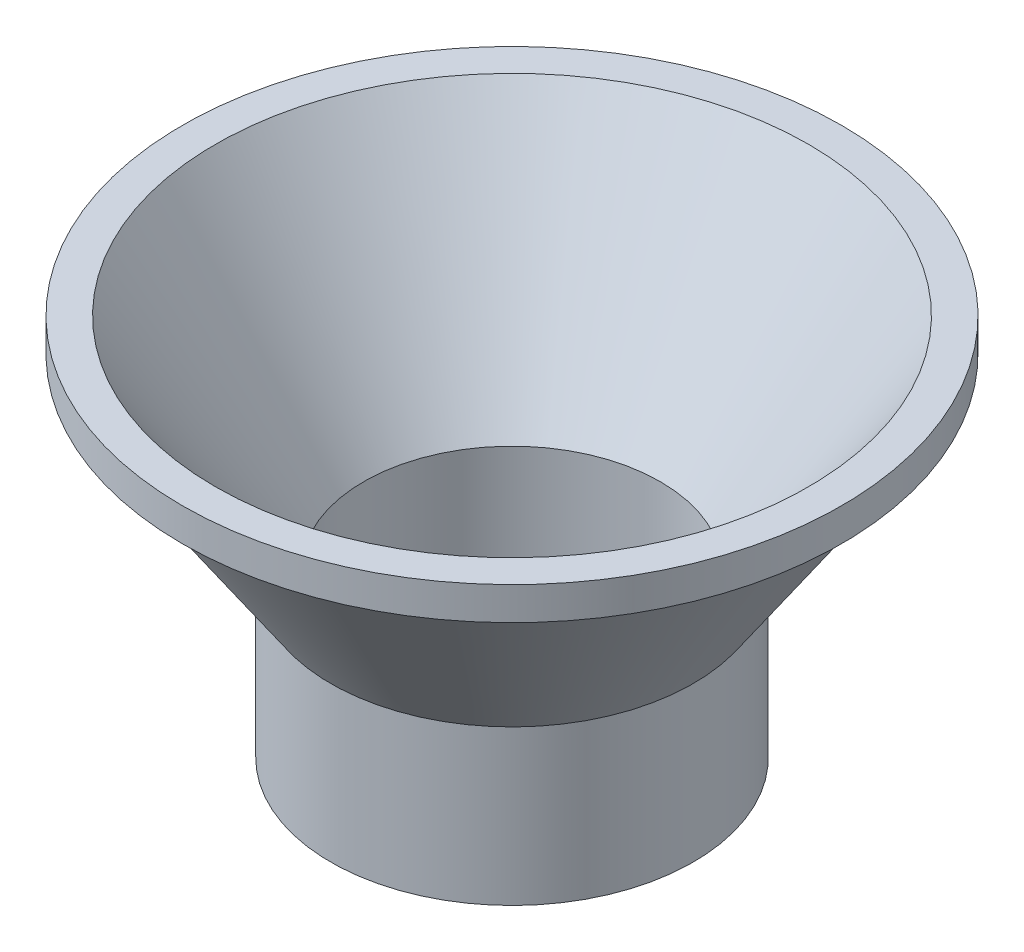
ISO-10303-21;
HEADER;
FILE_DESCRIPTION(('STEP AP214'),'2;1');
FILE_NAME('part.step','',(''),(''),'','','');
FILE_SCHEMA(('AUTOMOTIVE_DESIGN { 1 0 10303 214 1 1 1 1 }'));
ENDSEC;
DATA;
#1=APPLICATION_CONTEXT('core data for automotive mechanical design processes');
#2=APPLICATION_PROTOCOL_DEFINITION('international standard','automotive_design',2000,#1);
#3=PRODUCT_CONTEXT('',#1,'mechanical');
#4=PRODUCT('Part','Part','',(#3));
#5=PRODUCT_RELATED_PRODUCT_CATEGORY('part','',(#4));
#6=PRODUCT_DEFINITION_FORMATION('','',#4);
#7=PRODUCT_DEFINITION_CONTEXT('part definition',#1,'design');
#8=PRODUCT_DEFINITION('design','',#6,#7);
#9=PRODUCT_DEFINITION_SHAPE('','',#8);
#10=(LENGTH_UNIT() NAMED_UNIT(*) SI_UNIT(.MILLI.,.METRE.));
#11=(NAMED_UNIT(*) PLANE_ANGLE_UNIT() SI_UNIT($,.RADIAN.));
#12=(NAMED_UNIT(*) SI_UNIT($,.STERADIAN.) SOLID_ANGLE_UNIT());
#13=UNCERTAINTY_MEASURE_WITH_UNIT(LENGTH_MEASURE(1.E-05),#10,'distance_accuracy_value','');
#14=(GEOMETRIC_REPRESENTATION_CONTEXT(3) GLOBAL_UNCERTAINTY_ASSIGNED_CONTEXT((#13)) GLOBAL_UNIT_ASSIGNED_CONTEXT((#10,
#11,#12)) REPRESENTATION_CONTEXT('',''));
#15=CARTESIAN_POINT('',(0.,0.,0.));
#16=DIRECTION('',(0.,0.,1.));
#17=DIRECTION('',(1.,0.,0.));
#18=AXIS2_PLACEMENT_3D('',#15,#16,#17);
#19=CARTESIAN_POINT('',(-18.,13.2287565553229,0.));
#20=DIRECTION('',(0.,-1.,0.));
#21=DIRECTION('',(0.,0.,-1.));
#22=AXIS2_PLACEMENT_3D('',#19,#20,#21);
#23=PLANE('',#22);
#24=CARTESIAN_POINT('',(0.,13.2287565553229,0.));
#25=DIRECTION('',(0.,-1.,0.));
#26=DIRECTION('',(0.,0.,-1.));
#27=AXIS2_PLACEMENT_3D('',#24,#25,#26);
#28=CIRCLE('',#27,20.);
#29=CARTESIAN_POINT('',(0.,13.2287565553229,-20.));
#30=VERTEX_POINT('',#29);
#31=EDGE_CURVE('E63',#30,#30,#28,.T.);
#32=ORIENTED_EDGE('',*,*,#31,.F.);
#33=EDGE_LOOP('',(#32));
#34=FACE_BOUND('',#33,.T.);
#35=CARTESIAN_POINT('',(0.,13.228756555323,0.));
#36=DIRECTION('',(0.,-1.,0.));
#37=DIRECTION('',(0.,0.,-1.));
#38=AXIS2_PLACEMENT_3D('',#35,#36,#37);
#39=CIRCLE('',#38,18.);
#40=CARTESIAN_POINT('',(0.,13.228756555323,-18.));
#41=VERTEX_POINT('',#40);
#42=EDGE_CURVE('E10',#41,#41,#39,.T.);
#43=ORIENTED_EDGE('',*,*,#42,.T.);
#44=EDGE_LOOP('',(#43));
#45=FACE_BOUND('',#44,.T.);
#46=ADVANCED_FACE('F35',(#34,#45),#23,.F.);
#47=CARTESIAN_POINT('',(0.,0.,0.));
#48=DIRECTION('',(0.,1.,0.));
#49=DIRECTION('',(0.,0.,1.));
#50=AXIS2_PLACEMENT_3D('',#47,#48,#49);
#51=CONICAL_SURFACE('',#50,9.,0.59740641664535);
#52=ORIENTED_EDGE('',*,*,#42,.F.);
#53=EDGE_LOOP('',(#52));
#54=FACE_BOUND('',#53,.T.);
#55=CARTESIAN_POINT('',(0.,0.,0.));
#56=DIRECTION('',(0.,-1.,0.));
#57=DIRECTION('',(0.,0.,-1.));
#58=AXIS2_PLACEMENT_3D('',#55,#56,#57);
#59=CIRCLE('',#58,9.);
#60=CARTESIAN_POINT('',(0.,0.,-9.));
#61=VERTEX_POINT('',#60);
#62=EDGE_CURVE('E41',#61,#61,#59,.T.);
#63=ORIENTED_EDGE('',*,*,#62,.T.);
#64=EDGE_LOOP('',(#63));
#65=FACE_BOUND('',#64,.T.);
#66=ADVANCED_FACE('F71',(#54,#65),#51,.F.);
#67=CARTESIAN_POINT('',(0.,0.,0.));
#68=DIRECTION('',(0.,-1.,0.));
#69=DIRECTION('',(0.,0.,-1.));
#70=AXIS2_PLACEMENT_3D('',#67,#68,#69);
#71=CYLINDRICAL_SURFACE('',#70,9.);
#72=ORIENTED_EDGE('',*,*,#62,.F.);
#73=EDGE_LOOP('',(#72));
#74=FACE_BOUND('',#73,.T.);
#75=CARTESIAN_POINT('',(0.,-10.,0.));
#76=DIRECTION('',(0.,-1.,0.));
#77=DIRECTION('',(0.,0.,-1.));
#78=AXIS2_PLACEMENT_3D('',#75,#76,#77);
#79=CIRCLE('',#78,9.);
#80=CARTESIAN_POINT('',(0.,-10.,-9.));
#81=VERTEX_POINT('',#80);
#82=EDGE_CURVE('E45',#81,#81,#79,.T.);
#83=ORIENTED_EDGE('',*,*,#82,.T.);
#84=EDGE_LOOP('',(#83));
#85=FACE_BOUND('',#84,.T.);
#86=ADVANCED_FACE('F75',(#74,#85),#71,.F.);
#87=CARTESIAN_POINT('',(-9.,-10.,0.));
#88=DIRECTION('',(0.,-1.,0.));
#89=DIRECTION('',(0.,0.,-1.));
#90=AXIS2_PLACEMENT_3D('',#87,#88,#89);
#91=PLANE('',#90);
#92=CARTESIAN_POINT('',(0.,-10.,0.));
#93=DIRECTION('',(0.,-1.,0.));
#94=DIRECTION('',(0.,0.,-1.));
#95=AXIS2_PLACEMENT_3D('',#92,#93,#94);
#96=CIRCLE('',#95,11.);
#97=CARTESIAN_POINT('',(0.,-10.,-11.));
#98=VERTEX_POINT('',#97);
#99=EDGE_CURVE('E49',#98,#98,#96,.T.);
#100=ORIENTED_EDGE('',*,*,#99,.T.);
#101=EDGE_LOOP('',(#100));
#102=FACE_BOUND('',#101,.T.);
#103=ORIENTED_EDGE('',*,*,#82,.F.);
#104=EDGE_LOOP('',(#103));
#105=FACE_BOUND('',#104,.T.);
#106=ADVANCED_FACE('F80',(#102,#105),#91,.T.);
#107=CARTESIAN_POINT('',(0.,0.,0.));
#108=DIRECTION('',(0.,-1.,0.));
#109=DIRECTION('',(0.,0.,-1.));
#110=AXIS2_PLACEMENT_3D('',#107,#108,#109);
#111=CYLINDRICAL_SURFACE('',#110,11.);
#112=CARTESIAN_POINT('',(0.,-0.615831876594899,0.));
#113=DIRECTION('',(0.,-1.,0.));
#114=DIRECTION('',(0.,0.,-1.));
#115=AXIS2_PLACEMENT_3D('',#112,#113,#114);
#116=CIRCLE('',#115,11.);
#117=CARTESIAN_POINT('',(0.,-0.615831876594899,-11.));
#118=VERTEX_POINT('',#117);
#119=EDGE_CURVE('E54',#118,#118,#116,.T.);
#120=ORIENTED_EDGE('',*,*,#119,.T.);
#121=EDGE_LOOP('',(#120));
#122=FACE_BOUND('',#121,.T.);
#123=ORIENTED_EDGE('',*,*,#99,.F.);
#124=EDGE_LOOP('',(#123));
#125=FACE_BOUND('',#124,.T.);
#126=ADVANCED_FACE('F86',(#122,#125),#111,.T.);
#127=CARTESIAN_POINT('',(0.,-0.615831876594899,0.));
#128=DIRECTION('',(0.,1.,0.));
#129=DIRECTION('',(0.,0.,1.));
#130=AXIS2_PLACEMENT_3D('',#127,#128,#129);
#131=CONICAL_SURFACE('',#130,11.,0.59740641664535);
#132=CARTESIAN_POINT('',(0.,11.2287565553229,0.));
#133=DIRECTION('',(0.,-1.,0.));
#134=DIRECTION('',(0.,0.,-1.));
#135=AXIS2_PLACEMENT_3D('',#132,#133,#134);
#136=CIRCLE('',#135,19.0583005244258);
#137=CARTESIAN_POINT('',(0.,11.2287565553229,-19.0583005244258));
#138=VERTEX_POINT('',#137);
#139=EDGE_CURVE('E57',#138,#138,#136,.T.);
#140=ORIENTED_EDGE('',*,*,#139,.T.);
#141=EDGE_LOOP('',(#140));
#142=FACE_BOUND('',#141,.T.);
#143=ORIENTED_EDGE('',*,*,#119,.F.);
#144=EDGE_LOOP('',(#143));
#145=FACE_BOUND('',#144,.T.);
#146=ADVANCED_FACE('F90',(#142,#145),#131,.T.);
#147=CARTESIAN_POINT('',(-18.,11.2287565553229,0.));
#148=DIRECTION('',(0.,-1.,0.));
#149=DIRECTION('',(0.,0.,-1.));
#150=AXIS2_PLACEMENT_3D('',#147,#148,#149);
#151=PLANE('',#150);
#152=CARTESIAN_POINT('',(0.,11.2287565553229,0.));
#153=DIRECTION('',(0.,-1.,0.));
#154=DIRECTION('',(0.,0.,-1.));
#155=AXIS2_PLACEMENT_3D('',#152,#153,#154);
#156=CIRCLE('',#155,20.);
#157=CARTESIAN_POINT('',(0.,11.2287565553229,-20.));
#158=VERTEX_POINT('',#157);
#159=EDGE_CURVE('E60',#158,#158,#156,.T.);
#160=ORIENTED_EDGE('',*,*,#159,.T.);
#161=EDGE_LOOP('',(#160));
#162=FACE_BOUND('',#161,.T.);
#163=ORIENTED_EDGE('',*,*,#139,.F.);
#164=EDGE_LOOP('',(#163));
#165=FACE_BOUND('',#164,.T.);
#166=ADVANCED_FACE('F94',(#162,#165),#151,.T.);
#167=CARTESIAN_POINT('',(0.,0.,0.));
#168=DIRECTION('',(0.,-1.,0.));
#169=DIRECTION('',(0.,0.,-1.));
#170=AXIS2_PLACEMENT_3D('',#167,#168,#169);
#171=CYLINDRICAL_SURFACE('',#170,20.);
#172=ORIENTED_EDGE('',*,*,#31,.T.);
#173=EDGE_LOOP('',(#172));
#174=FACE_BOUND('',#173,.T.);
#175=ORIENTED_EDGE('',*,*,#159,.F.);
#176=EDGE_LOOP('',(#175));
#177=FACE_BOUND('',#176,.T.);
#178=ADVANCED_FACE('F67',(#174,#177),#171,.T.);
#179=CLOSED_SHELL('',(#46,#66,#86,#106,#126,#146,#166,#178));
#180=MANIFOLD_SOLID_BREP('B2',#179);
#181=ADVANCED_BREP_SHAPE_REPRESENTATION('',(#18,#180),#14);
#182=SHAPE_DEFINITION_REPRESENTATION(#9,#181);
ENDSEC;
END-ISO-10303-21;
